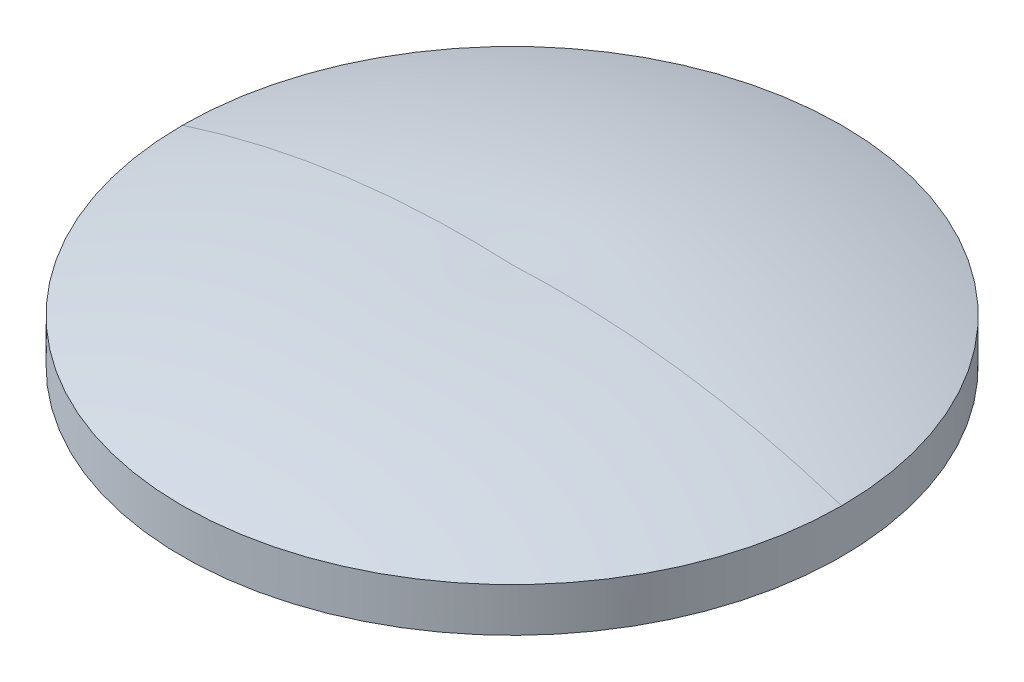
ISO-10303-21;
HEADER;
FILE_DESCRIPTION(('STEP AP214'),'2;1');
FILE_NAME('part.step','',(''),(''),'','','');
FILE_SCHEMA(('AUTOMOTIVE_DESIGN { 1 0 10303 214 1 1 1 1 }'));
ENDSEC;
DATA;
#1=APPLICATION_CONTEXT('core data for automotive mechanical design processes');
#2=APPLICATION_PROTOCOL_DEFINITION('international standard','automotive_design',2000,#1);
#3=PRODUCT_CONTEXT('',#1,'mechanical');
#4=PRODUCT('Part','Part','',(#3));
#5=PRODUCT_RELATED_PRODUCT_CATEGORY('part','',(#4));
#6=PRODUCT_DEFINITION_FORMATION('','',#4);
#7=PRODUCT_DEFINITION_CONTEXT('part definition',#1,'design');
#8=PRODUCT_DEFINITION('design','',#6,#7);
#9=PRODUCT_DEFINITION_SHAPE('','',#8);
#10=(LENGTH_UNIT() NAMED_UNIT(*) SI_UNIT(.MILLI.,.METRE.));
#11=(NAMED_UNIT(*) PLANE_ANGLE_UNIT() SI_UNIT($,.RADIAN.));
#12=(NAMED_UNIT(*) SI_UNIT($,.STERADIAN.) SOLID_ANGLE_UNIT());
#13=UNCERTAINTY_MEASURE_WITH_UNIT(LENGTH_MEASURE(1.E-05),#10,'distance_accuracy_value','');
#14=(GEOMETRIC_REPRESENTATION_CONTEXT(3) GLOBAL_UNCERTAINTY_ASSIGNED_CONTEXT((#13)) GLOBAL_UNIT_ASSIGNED_CONTEXT((#10,
#11,#12)) REPRESENTATION_CONTEXT('',''));
#15=CARTESIAN_POINT('',(0.,0.,0.));
#16=DIRECTION('',(0.,0.,1.));
#17=DIRECTION('',(1.,0.,0.));
#18=AXIS2_PLACEMENT_3D('',#15,#16,#17);
#19=CARTESIAN_POINT('',(15.,2.,0.));
#20=CARTESIAN_POINT('',(15.,2.,30.));
#21=CARTESIAN_POINT('',(-15.,2.,30.));
#22=CARTESIAN_POINT('',(-15.,2.,0.));
#23=CARTESIAN_POINT('',(7.71670142989487,4.36533185690092,0.));
#24=CARTESIAN_POINT('',(7.71670142989487,4.36533185690092,15.4334028597897));
#25=CARTESIAN_POINT('',(-7.71670142989487,4.36533185690092,15.4334028597897));
#26=CARTESIAN_POINT('',(-7.71670142989487,4.36533185690092,0.));
#27=CARTESIAN_POINT('',(0.,4.,0.));
#28=CARTESIAN_POINT('',(0.,4.,0.));
#29=CARTESIAN_POINT('',(0.,4.,0.));
#30=CARTESIAN_POINT('',(0.,4.,0.));
#31=(BOUNDED_SURFACE() B_SPLINE_SURFACE(2,3,((#19,#20,#21,#22),(#23,#24,#25,#26),(#27,#28,#29,
#30)),.UNSPECIFIED.,.F.,.F.,.F.) B_SPLINE_SURFACE_WITH_KNOTS((3,3),(4,4),(0.,1.),(0.,1.),
.UNSPECIFIED.) GEOMETRIC_REPRESENTATION_ITEM() RATIONAL_B_SPLINE_SURFACE(((1.,0.333333333333333,
0.333333333333333,1.),(1.,0.333333333333333,0.333333333333333,1.),(1.,0.333333333333333,
0.333333333333333,1.))) REPRESENTATION_ITEM('') SURFACE());
#32=CARTESIAN_POINT('',(0.,2.,0.));
#33=DIRECTION('',(0.,-1.,0.));
#34=DIRECTION('',(0.,0.,-1.));
#35=AXIS2_PLACEMENT_3D('',#32,#33,#34);
#36=CIRCLE('',#35,15.);
#37=CARTESIAN_POINT('',(15.,2.,0.));
#38=VERTEX_POINT('',#37);
#39=CARTESIAN_POINT('',(-15.,2.,0.));
#40=VERTEX_POINT('',#39);
#41=EDGE_CURVE('E38',#38,#40,#36,.T.);
#42=CARTESIAN_POINT('',(15.,2.,0.));
#43=CARTESIAN_POINT('',(7.71670142989487,4.36533185690092,0.));
#44=CARTESIAN_POINT('',(0.,4.,0.));
#45=B_SPLINE_CURVE_WITH_KNOTS('',2,(#42,#43,#44),.UNSPECIFIED.,.F.,.F.,(3,3),(0.,1.),.UNSPECIFIED.);
#46=CARTESIAN_POINT('',(0.,4.,0.));
#47=VERTEX_POINT('',#46);
#48=EDGE_CURVE('E41',#47,#38,#45,.F.);
#49=CARTESIAN_POINT('',(-15.,2.,0.));
#50=CARTESIAN_POINT('',(-7.71670142989487,4.36533185690092,0.));
#51=CARTESIAN_POINT('',(0.,4.,0.));
#52=B_SPLINE_CURVE_WITH_KNOTS('',2,(#49,#50,#51),.UNSPECIFIED.,.F.,.F.,(3,3),(0.,1.),.UNSPECIFIED.);
#53=EDGE_CURVE('E33',#40,#47,#52,.T.);
#54=ORIENTED_EDGE('',*,*,#41,.F.);
#55=ORIENTED_EDGE('',*,*,#48,.F.);
#56=ORIENTED_EDGE('',*,*,#53,.F.);
#57=EDGE_LOOP('',(#54,#55,#56));
#58=FACE_BOUND('',#57,.T.);
#59=ADVANCED_FACE('F17',(#58),#31,.T.);
#60=CARTESIAN_POINT('',(-15.,2.,0.));
#61=CARTESIAN_POINT('',(-15.,2.,-30.));
#62=CARTESIAN_POINT('',(15.,2.,-30.));
#63=CARTESIAN_POINT('',(15.,2.,0.));
#64=CARTESIAN_POINT('',(-7.71670142989487,4.36533185690092,0.));
#65=CARTESIAN_POINT('',(-7.71670142989487,4.36533185690092,-15.4334028597897));
#66=CARTESIAN_POINT('',(7.71670142989486,4.36533185690092,-15.4334028597897));
#67=CARTESIAN_POINT('',(7.71670142989487,4.36533185690092,0.));
#68=CARTESIAN_POINT('',(0.,4.,0.));
#69=CARTESIAN_POINT('',(0.,4.,0.));
#70=CARTESIAN_POINT('',(0.,4.,0.));
#71=CARTESIAN_POINT('',(0.,4.,0.));
#72=(BOUNDED_SURFACE() B_SPLINE_SURFACE(2,3,((#60,#61,#62,#63),(#64,#65,#66,#67),(#68,#69,#70,
#71)),.UNSPECIFIED.,.F.,.F.,.F.) B_SPLINE_SURFACE_WITH_KNOTS((3,3),(4,4),(0.,1.),(0.,1.),
.UNSPECIFIED.) GEOMETRIC_REPRESENTATION_ITEM() RATIONAL_B_SPLINE_SURFACE(((1.,0.333333333333333,
0.333333333333333,1.),(1.,0.333333333333333,0.333333333333333,1.),(1.,0.333333333333333,
0.333333333333333,1.))) REPRESENTATION_ITEM('') SURFACE());
#73=CARTESIAN_POINT('',(0.,2.,0.));
#74=DIRECTION('',(0.,-1.,0.));
#75=DIRECTION('',(0.,0.,-1.));
#76=AXIS2_PLACEMENT_3D('',#73,#74,#75);
#77=CIRCLE('',#76,15.);
#78=EDGE_CURVE('E26',#40,#38,#77,.T.);
#79=ORIENTED_EDGE('',*,*,#48,.T.);
#80=ORIENTED_EDGE('',*,*,#78,.F.);
#81=ORIENTED_EDGE('',*,*,#53,.T.);
#82=EDGE_LOOP('',(#79,#80,#81));
#83=FACE_BOUND('',#82,.T.);
#84=ADVANCED_FACE('F44',(#83),#72,.T.);
#85=CARTESIAN_POINT('',(0.,0.,0.));
#86=DIRECTION('',(0.,-1.,0.));
#87=DIRECTION('',(0.,0.,-1.));
#88=AXIS2_PLACEMENT_3D('',#85,#86,#87);
#89=CYLINDRICAL_SURFACE('',#88,15.);
#90=ORIENTED_EDGE('',*,*,#78,.T.);
#91=ORIENTED_EDGE('',*,*,#41,.T.);
#92=EDGE_LOOP('',(#90,#91));
#93=FACE_BOUND('',#92,.T.);
#94=CARTESIAN_POINT('',(0.,0.,0.));
#95=DIRECTION('',(0.,-1.,0.));
#96=DIRECTION('',(0.,0.,-1.));
#97=AXIS2_PLACEMENT_3D('',#94,#95,#96);
#98=CIRCLE('',#97,15.);
#99=CARTESIAN_POINT('',(0.,0.,-15.));
#100=VERTEX_POINT('',#99);
#101=EDGE_CURVE('E11',#100,#100,#98,.T.);
#102=ORIENTED_EDGE('',*,*,#101,.F.);
#103=EDGE_LOOP('',(#102));
#104=FACE_BOUND('',#103,.T.);
#105=ADVANCED_FACE('F66',(#93,#104),#89,.T.);
#106=CARTESIAN_POINT('',(0.,0.,0.));
#107=DIRECTION('',(0.,-1.,0.));
#108=DIRECTION('',(0.,0.,-1.));
#109=AXIS2_PLACEMENT_3D('',#106,#107,#108);
#110=PLANE('',#109);
#111=ORIENTED_EDGE('',*,*,#101,.T.);
#112=EDGE_LOOP('',(#111));
#113=FACE_BOUND('',#112,.T.);
#114=ADVANCED_FACE('F69',(#113),#110,.T.);
#115=CLOSED_SHELL('',(#59,#84,#105,#114));
#116=MANIFOLD_SOLID_BREP('B1',#115);
#117=ADVANCED_BREP_SHAPE_REPRESENTATION('',(#18,#116),#14);
#118=SHAPE_DEFINITION_REPRESENTATION(#9,#117);
ENDSEC;
END-ISO-10303-21;
